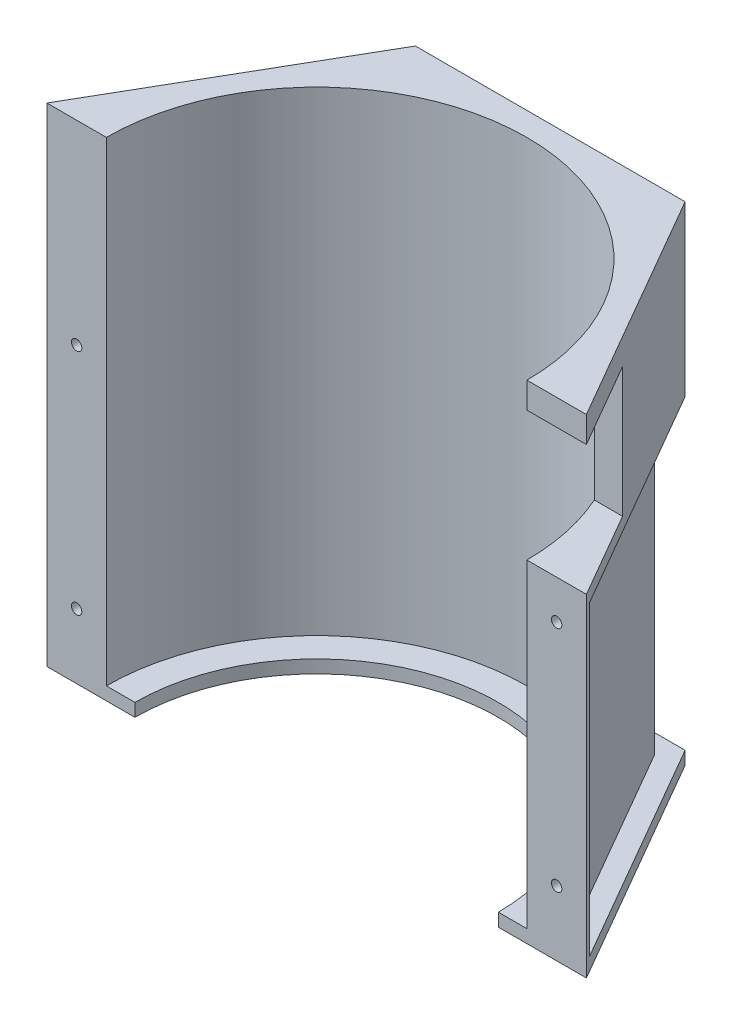
ISO-10303-21;
HEADER;
FILE_DESCRIPTION(('STEP AP214'),'2;1');
FILE_NAME('part.step','',(''),(''),'','','');
FILE_SCHEMA(('AUTOMOTIVE_DESIGN { 1 0 10303 214 1 1 1 1 }'));
ENDSEC;
DATA;
#1=APPLICATION_CONTEXT('core data for automotive mechanical design processes');
#2=APPLICATION_PROTOCOL_DEFINITION('international standard','automotive_design',2000,#1);
#3=PRODUCT_CONTEXT('',#1,'mechanical');
#4=PRODUCT('Part','Part','',(#3));
#5=PRODUCT_RELATED_PRODUCT_CATEGORY('part','',(#4));
#6=PRODUCT_DEFINITION_FORMATION('','',#4);
#7=PRODUCT_DEFINITION_CONTEXT('part definition',#1,'design');
#8=PRODUCT_DEFINITION('design','',#6,#7);
#9=PRODUCT_DEFINITION_SHAPE('','',#8);
#10=(LENGTH_UNIT() NAMED_UNIT(*) SI_UNIT(.MILLI.,.METRE.));
#11=(NAMED_UNIT(*) PLANE_ANGLE_UNIT() SI_UNIT($,.RADIAN.));
#12=(NAMED_UNIT(*) SI_UNIT($,.STERADIAN.) SOLID_ANGLE_UNIT());
#13=UNCERTAINTY_MEASURE_WITH_UNIT(LENGTH_MEASURE(1.E-05),#10,'distance_accuracy_value','');
#14=(GEOMETRIC_REPRESENTATION_CONTEXT(3) GLOBAL_UNCERTAINTY_ASSIGNED_CONTEXT((#13)) GLOBAL_UNIT_ASSIGNED_CONTEXT((#10,
#11,#12)) REPRESENTATION_CONTEXT('',''));
#15=CARTESIAN_POINT('',(0.,0.,0.));
#16=DIRECTION('',(0.,0.,1.));
#17=DIRECTION('',(1.,0.,0.));
#18=AXIS2_PLACEMENT_3D('',#15,#16,#17);
#19=CARTESIAN_POINT('',(0.,5.,0.));
#20=DIRECTION('',(0.,1.,0.));
#21=DIRECTION('',(0.,0.,1.));
#22=AXIS2_PLACEMENT_3D('',#19,#20,#21);
#23=PLANE('',#22);
#24=CARTESIAN_POINT('',(0.,5.,0.));
#25=DIRECTION('',(0.,-1.,0.));
#26=DIRECTION('',(0.,0.,1.));
#27=AXIS2_PLACEMENT_3D('',#24,#25,#26);
#28=CIRCLE('',#27,81.);
#29=CARTESIAN_POINT('',(-81.,5.,0.));
#30=VERTEX_POINT('',#29);
#31=CARTESIAN_POINT('',(81.,5.,0.));
#32=VERTEX_POINT('',#31);
#33=EDGE_CURVE('E257',#30,#32,#28,.T.);
#34=ORIENTED_EDGE('',*,*,#33,.F.);
#35=DIRECTION('',(1.,0.,0.));
#36=VECTOR('',#35,1.);
#37=CARTESIAN_POINT('',(-103.923048454133,5.,0.));
#38=LINE('',#37,#36);
#39=CARTESIAN_POINT('',(-70.,5.,0.));
#40=VERTEX_POINT('',#39);
#41=EDGE_CURVE('E513',#30,#40,#38,.T.);
#42=ORIENTED_EDGE('',*,*,#41,.T.);
#43=CARTESIAN_POINT('',(0.,5.,0.));
#44=DIRECTION('',(0.,-1.,0.));
#45=DIRECTION('',(0.,0.,1.));
#46=AXIS2_PLACEMENT_3D('',#43,#44,#45);
#47=CIRCLE('',#46,70.);
#48=CARTESIAN_POINT('',(70.,5.,0.));
#49=VERTEX_POINT('',#48);
#50=EDGE_CURVE('E450',#40,#49,#47,.T.);
#51=ORIENTED_EDGE('',*,*,#50,.T.);
#52=DIRECTION('',(1.,0.,0.));
#53=VECTOR('',#52,1.);
#54=CARTESIAN_POINT('',(70.,5.,0.));
#55=LINE('',#54,#53);
#56=EDGE_CURVE('E463',#49,#32,#55,.T.);
#57=ORIENTED_EDGE('',*,*,#56,.T.);
#58=EDGE_LOOP('',(#34,#42,#51,#57));
#59=FACE_BOUND('',#58,.T.);
#60=ADVANCED_FACE('F40',(#59),#23,.T.);
#61=CARTESIAN_POINT('',(70.,5.,0.));
#62=DIRECTION('',(0.,0.,-1.));
#63=DIRECTION('',(-1.,0.,0.));
#64=AXIS2_PLACEMENT_3D('',#61,#62,#63);
#65=PLANE('',#64);
#66=CARTESIAN_POINT('',(92.4615242270663,25.,0.));
#67=DIRECTION('',(0.,0.,1.));
#68=DIRECTION('',(1.,0.,0.));
#69=AXIS2_PLACEMENT_3D('',#66,#67,#68);
#70=CIRCLE('',#69,2.);
#71=CARTESIAN_POINT('',(94.4615242270663,25.,0.));
#72=VERTEX_POINT('',#71);
#73=EDGE_CURVE('E394',#72,#72,#70,.T.);
#74=ORIENTED_EDGE('',*,*,#73,.F.);
#75=EDGE_LOOP('',(#74));
#76=FACE_BOUND('',#75,.T.);
#77=CARTESIAN_POINT('',(92.4615242270663,113.,0.));
#78=DIRECTION('',(0.,0.,1.));
#79=DIRECTION('',(1.,0.,0.));
#80=AXIS2_PLACEMENT_3D('',#77,#78,#79);
#81=CIRCLE('',#80,2.);
#82=CARTESIAN_POINT('',(94.4615242270663,113.,0.));
#83=VERTEX_POINT('',#82);
#84=EDGE_CURVE('E389',#83,#83,#81,.T.);
#85=ORIENTED_EDGE('',*,*,#84,.F.);
#86=EDGE_LOOP('',(#85));
#87=FACE_BOUND('',#86,.T.);
#88=DIRECTION('',(1.,0.,0.));
#89=VECTOR('',#88,1.);
#90=CARTESIAN_POINT('',(70.,0.,0.));
#91=LINE('',#90,#89);
#92=CARTESIAN_POINT('',(70.,0.,0.));
#93=VERTEX_POINT('',#92);
#94=CARTESIAN_POINT('',(103.923048454133,0.,0.));
#95=VERTEX_POINT('',#94);
#96=EDGE_CURVE('E431',#93,#95,#91,.T.);
#97=ORIENTED_EDGE('',*,*,#96,.T.);
#98=DIRECTION('',(0.,-1.,0.));
#99=VECTOR('',#98,1.);
#100=CARTESIAN_POINT('',(103.923048454133,5.,0.));
#101=LINE('',#100,#99);
#102=CARTESIAN_POINT('',(103.923048454133,128.,0.));
#103=VERTEX_POINT('',#102);
#104=EDGE_CURVE('E210',#103,#95,#101,.T.);
#105=ORIENTED_EDGE('',*,*,#104,.F.);
#106=DIRECTION('',(1.,0.,0.));
#107=VECTOR('',#106,1.);
#108=CARTESIAN_POINT('',(81.,128.,0.));
#109=LINE('',#108,#107);
#110=CARTESIAN_POINT('',(81.,128.,0.));
#111=VERTEX_POINT('',#110);
#112=EDGE_CURVE('E309',#111,#103,#109,.T.);
#113=ORIENTED_EDGE('',*,*,#112,.F.);
#114=DIRECTION('',(0.,-1.,0.));
#115=VECTOR('',#114,1.);
#116=CARTESIAN_POINT('',(81.,123.,0.));
#117=LINE('',#116,#115);
#118=EDGE_CURVE('E251',#111,#32,#117,.T.);
#119=ORIENTED_EDGE('',*,*,#118,.T.);
#120=ORIENTED_EDGE('',*,*,#56,.F.);
#121=DIRECTION('',(0.,-1.,0.));
#122=VECTOR('',#121,1.);
#123=CARTESIAN_POINT('',(70.,5.,0.));
#124=LINE('',#123,#122);
#125=EDGE_CURVE('E464',#49,#93,#124,.T.);
#126=ORIENTED_EDGE('',*,*,#125,.T.);
#127=EDGE_LOOP('',(#97,#105,#113,#119,#120,#126));
#128=FACE_BOUND('',#127,.T.);
#129=ADVANCED_FACE('F42',(#76,#87,#128),#65,.F.);
#130=CARTESIAN_POINT('',(103.923048454133,5.,0.));
#131=DIRECTION('',(-0.866025403784438,0.,0.5));
#132=DIRECTION('',(0.5,0.,0.866025403784439));
#133=AXIS2_PLACEMENT_3D('',#130,#131,#132);
#134=PLANE('',#133);
#135=DIRECTION('',(-0.5,0.,-0.866025403784439));
#136=VECTOR('',#135,1.);
#137=CARTESIAN_POINT('',(103.923048454133,0.,0.));
#138=LINE('',#137,#136);
#139=CARTESIAN_POINT('',(51.9615242270663,0.,-90.0000000000001));
#140=VERTEX_POINT('',#139);
#141=EDGE_CURVE('E435',#95,#140,#138,.T.);
#142=ORIENTED_EDGE('',*,*,#141,.T.);
#143=DIRECTION('',(0.,-1.,0.));
#144=VECTOR('',#143,1.);
#145=CARTESIAN_POINT('',(51.9615242270663,5.,-90.0000000000001));
#146=LINE('',#145,#144);
#147=CARTESIAN_POINT('',(51.9615242270663,5.,-90.0000000000001));
#148=VERTEX_POINT('',#147);
#149=EDGE_CURVE('E479',#148,#140,#146,.T.);
#150=ORIENTED_EDGE('',*,*,#149,.F.);
#151=DIRECTION('',(-0.5,0.,-0.866025403784439));
#152=VECTOR('',#151,1.);
#153=CARTESIAN_POINT('',(103.923048454133,5.,0.));
#154=LINE('',#153,#152);
#155=CARTESIAN_POINT('',(102.190997646564,5.,-3.00000000000001));
#156=VERTEX_POINT('',#155);
#157=EDGE_CURVE('E505',#156,#148,#154,.T.);
#158=ORIENTED_EDGE('',*,*,#157,.F.);
#159=DIRECTION('',(0.,-1.,0.));
#160=VECTOR('',#159,1.);
#161=CARTESIAN_POINT('',(102.190997646564,123.,-3.00000000000001));
#162=LINE('',#161,#160);
#163=CARTESIAN_POINT('',(102.190997646564,123.,-3.00000000000001));
#164=VERTEX_POINT('',#163);
#165=EDGE_CURVE('E440',#164,#156,#162,.T.);
#166=ORIENTED_EDGE('',*,*,#165,.F.);
#167=DIRECTION('',(-0.5,0.,-0.866025403784438));
#168=VECTOR('',#167,1.);
#169=CARTESIAN_POINT('',(103.923048454133,123.,0.));
#170=LINE('',#169,#168);
#171=CARTESIAN_POINT('',(51.9615242270663,123.,-90.0000000000001));
#172=VERTEX_POINT('',#171);
#173=EDGE_CURVE('E313',#164,#172,#170,.T.);
#174=ORIENTED_EDGE('',*,*,#173,.T.);
#175=DIRECTION('',(0.,-1.,0.));
#176=VECTOR('',#175,1.);
#177=CARTESIAN_POINT('',(51.9615242270663,128.,-90.0000000000001));
#178=LINE('',#177,#176);
#179=CARTESIAN_POINT('',(51.9615242270663,188.,-90.0000000000001));
#180=VERTEX_POINT('',#179);
#181=EDGE_CURVE('E281',#180,#172,#178,.T.);
#182=ORIENTED_EDGE('',*,*,#181,.F.);
#183=DIRECTION('',(-0.5,0.,-0.866025403784438));
#184=VECTOR('',#183,1.);
#185=CARTESIAN_POINT('',(51.9615242270663,188.,-90.0000000000001));
#186=LINE('',#185,#184);
#187=CARTESIAN_POINT('',(103.923048454133,188.,0.));
#188=VERTEX_POINT('',#187);
#189=EDGE_CURVE('E367',#188,#180,#186,.T.);
#190=ORIENTED_EDGE('',*,*,#189,.F.);
#191=DIRECTION('',(0.,-1.,0.));
#192=VECTOR('',#191,1.);
#193=CARTESIAN_POINT('',(103.923048454133,188.,0.));
#194=LINE('',#193,#192);
#195=CARTESIAN_POINT('',(103.923048454133,178.,0.));
#196=VERTEX_POINT('',#195);
#197=EDGE_CURVE('E344',#188,#196,#194,.T.);
#198=ORIENTED_EDGE('',*,*,#197,.T.);
#199=DIRECTION('',(-0.5,0.,-0.866025403784438));
#200=VECTOR('',#199,1.);
#201=CARTESIAN_POINT('',(51.9615242270663,178.,-90.0000000000001));
#202=LINE('',#201,#200);
#203=CARTESIAN_POINT('',(84.870489570875,178.,-33.));
#204=VERTEX_POINT('',#203);
#205=EDGE_CURVE('E349',#196,#204,#202,.T.);
#206=ORIENTED_EDGE('',*,*,#205,.T.);
#207=DIRECTION('',(0.,-1.,0.));
#208=VECTOR('',#207,1.);
#209=CARTESIAN_POINT('',(84.870489570875,178.,-33.));
#210=LINE('',#209,#208);
#211=CARTESIAN_POINT('',(84.870489570875,128.,-33.));
#212=VERTEX_POINT('',#211);
#213=EDGE_CURVE('E328',#204,#212,#210,.T.);
#214=ORIENTED_EDGE('',*,*,#213,.T.);
#215=DIRECTION('',(-0.5,0.,-0.866025403784438));
#216=VECTOR('',#215,1.);
#217=CARTESIAN_POINT('',(103.923048454133,128.,0.));
#218=LINE('',#217,#216);
#219=EDGE_CURVE('E319',#103,#212,#218,.T.);
#220=ORIENTED_EDGE('',*,*,#219,.F.);
#221=ORIENTED_EDGE('',*,*,#104,.T.);
#222=EDGE_LOOP('',(#142,#150,#158,#166,#174,#182,#190,#198,#206,#214,#220,#221));
#223=FACE_BOUND('',#222,.T.);
#224=ADVANCED_FACE('F544',(#223),#134,.F.);
#225=CARTESIAN_POINT('',(51.9615242270663,5.,-90.0000000000001));
#226=DIRECTION('',(0.,0.,1.));
#227=DIRECTION('',(1.,0.,0.));
#228=AXIS2_PLACEMENT_3D('',#225,#226,#227);
#229=PLANE('',#228);
#230=DIRECTION('',(-1.,0.,0.));
#231=VECTOR('',#230,1.);
#232=CARTESIAN_POINT('',(51.9615242270663,0.,-90.0000000000001));
#233=LINE('',#232,#231);
#234=CARTESIAN_POINT('',(-51.9615242270663,0.,-90.0000000000001));
#235=VERTEX_POINT('',#234);
#236=EDGE_CURVE('E444',#140,#235,#233,.T.);
#237=ORIENTED_EDGE('',*,*,#236,.T.);
#238=DIRECTION('',(0.,-1.,0.));
#239=VECTOR('',#238,1.);
#240=CARTESIAN_POINT('',(-51.9615242270663,5.,-90.0000000000001));
#241=LINE('',#240,#239);
#242=CARTESIAN_POINT('',(-51.9615242270663,5.,-90.0000000000001));
#243=VERTEX_POINT('',#242);
#244=EDGE_CURVE('E475',#243,#235,#241,.T.);
#245=ORIENTED_EDGE('',*,*,#244,.F.);
#246=DIRECTION('',(-1.,0.,0.));
#247=VECTOR('',#246,1.);
#248=CARTESIAN_POINT('',(51.9615242270663,5.,-90.0000000000001));
#249=LINE('',#248,#247);
#250=EDGE_CURVE('E508',#148,#243,#249,.T.);
#251=ORIENTED_EDGE('',*,*,#250,.F.);
#252=ORIENTED_EDGE('',*,*,#149,.T.);
#253=EDGE_LOOP('',(#237,#245,#251,#252));
#254=FACE_BOUND('',#253,.T.);
#255=ADVANCED_FACE('F540',(#254),#229,.F.);
#256=CARTESIAN_POINT('',(-51.9615242270663,5.,-90.0000000000001));
#257=DIRECTION('',(0.866025403784439,0.,0.5));
#258=DIRECTION('',(0.5,0.,-0.866025403784439));
#259=AXIS2_PLACEMENT_3D('',#256,#257,#258);
#260=PLANE('',#259);
#261=DIRECTION('',(-0.5,0.,0.866025403784439));
#262=VECTOR('',#261,1.);
#263=CARTESIAN_POINT('',(-51.9615242270663,0.,-90.0000000000001));
#264=LINE('',#263,#262);
#265=CARTESIAN_POINT('',(-103.923048454133,0.,0.));
#266=VERTEX_POINT('',#265);
#267=EDGE_CURVE('E455',#235,#266,#264,.T.);
#268=ORIENTED_EDGE('',*,*,#267,.T.);
#269=DIRECTION('',(0.,-1.,0.));
#270=VECTOR('',#269,1.);
#271=CARTESIAN_POINT('',(-103.923048454133,5.,0.));
#272=LINE('',#271,#270);
#273=CARTESIAN_POINT('',(-103.923048454133,188.,0.));
#274=VERTEX_POINT('',#273);
#275=EDGE_CURVE('E471',#274,#266,#272,.T.);
#276=ORIENTED_EDGE('',*,*,#275,.F.);
#277=DIRECTION('',(-0.5,0.,0.866025403784439));
#278=VECTOR('',#277,1.);
#279=CARTESIAN_POINT('',(-103.923048454133,188.,0.));
#280=LINE('',#279,#278);
#281=CARTESIAN_POINT('',(-51.9615242270663,188.,-90.0000000000001));
#282=VERTEX_POINT('',#281);
#283=EDGE_CURVE('E348',#282,#274,#280,.T.);
#284=ORIENTED_EDGE('',*,*,#283,.F.);
#285=DIRECTION('',(0.,-1.,0.));
#286=VECTOR('',#285,1.);
#287=CARTESIAN_POINT('',(-51.9615242270663,128.,-90.0000000000001));
#288=LINE('',#287,#286);
#289=CARTESIAN_POINT('',(-51.9615242270663,123.,-90.0000000000001));
#290=VERTEX_POINT('',#289);
#291=EDGE_CURVE('E301',#282,#290,#288,.T.);
#292=ORIENTED_EDGE('',*,*,#291,.T.);
#293=DIRECTION('',(-0.5,0.,0.866025403784439));
#294=VECTOR('',#293,1.);
#295=CARTESIAN_POINT('',(-51.9615242270663,123.,-90.0000000000001));
#296=LINE('',#295,#294);
#297=CARTESIAN_POINT('',(-102.190997646564,123.,-3.00000000000002));
#298=VERTEX_POINT('',#297);
#299=EDGE_CURVE('E306',#290,#298,#296,.T.);
#300=ORIENTED_EDGE('',*,*,#299,.T.);
#301=DIRECTION('',(0.,-1.,0.));
#302=VECTOR('',#301,1.);
#303=CARTESIAN_POINT('',(-102.190997646564,123.,-3.00000000000002));
#304=LINE('',#303,#302);
#305=CARTESIAN_POINT('',(-102.190997646564,5.,-3.00000000000003));
#306=VERTEX_POINT('',#305);
#307=EDGE_CURVE('E239',#298,#306,#304,.T.);
#308=ORIENTED_EDGE('',*,*,#307,.T.);
#309=DIRECTION('',(-0.5,0.,0.866025403784439));
#310=VECTOR('',#309,1.);
#311=CARTESIAN_POINT('',(-51.9615242270663,5.,-90.0000000000001));
#312=LINE('',#311,#310);
#313=EDGE_CURVE('E511',#243,#306,#312,.T.);
#314=ORIENTED_EDGE('',*,*,#313,.F.);
#315=ORIENTED_EDGE('',*,*,#244,.T.);
#316=EDGE_LOOP('',(#268,#276,#284,#292,#300,#308,#314,#315));
#317=FACE_BOUND('',#316,.T.);
#318=ADVANCED_FACE('F535',(#317),#260,.F.);
#319=CARTESIAN_POINT('',(-103.923048454133,5.,0.));
#320=DIRECTION('',(0.,0.,-1.));
#321=DIRECTION('',(-1.,0.,0.));
#322=AXIS2_PLACEMENT_3D('',#319,#320,#321);
#323=PLANE('',#322);
#324=CARTESIAN_POINT('',(-92.4615242270663,25.,0.));
#325=DIRECTION('',(0.,0.,1.));
#326=DIRECTION('',(1.,0.,0.));
#327=AXIS2_PLACEMENT_3D('',#324,#325,#326);
#328=CIRCLE('',#327,2.);
#329=CARTESIAN_POINT('',(-90.4615242270663,25.,0.));
#330=VERTEX_POINT('',#329);
#331=EDGE_CURVE('E390',#330,#330,#328,.T.);
#332=ORIENTED_EDGE('',*,*,#331,.F.);
#333=EDGE_LOOP('',(#332));
#334=FACE_BOUND('',#333,.T.);
#335=CARTESIAN_POINT('',(-92.4615242270663,113.,0.));
#336=DIRECTION('',(0.,0.,1.));
#337=DIRECTION('',(1.,0.,0.));
#338=AXIS2_PLACEMENT_3D('',#335,#336,#337);
#339=CIRCLE('',#338,2.);
#340=CARTESIAN_POINT('',(-90.4615242270663,113.,0.));
#341=VERTEX_POINT('',#340);
#342=EDGE_CURVE('E222',#341,#341,#339,.T.);
#343=ORIENTED_EDGE('',*,*,#342,.F.);
#344=EDGE_LOOP('',(#343));
#345=FACE_BOUND('',#344,.T.);
#346=DIRECTION('',(1.,0.,0.));
#347=VECTOR('',#346,1.);
#348=CARTESIAN_POINT('',(-103.923048454133,0.,0.));
#349=LINE('',#348,#347);
#350=CARTESIAN_POINT('',(-70.,0.,0.));
#351=VERTEX_POINT('',#350);
#352=EDGE_CURVE('E458',#266,#351,#349,.T.);
#353=ORIENTED_EDGE('',*,*,#352,.T.);
#354=DIRECTION('',(0.,-1.,0.));
#355=VECTOR('',#354,1.);
#356=CARTESIAN_POINT('',(-70.,5.,0.));
#357=LINE('',#356,#355);
#358=EDGE_CURVE('E467',#40,#351,#357,.T.);
#359=ORIENTED_EDGE('',*,*,#358,.F.);
#360=ORIENTED_EDGE('',*,*,#41,.F.);
#361=DIRECTION('',(0.,-1.,0.));
#362=VECTOR('',#361,1.);
#363=CARTESIAN_POINT('',(-81.,123.,0.));
#364=LINE('',#363,#362);
#365=CARTESIAN_POINT('',(-81.,188.,0.));
#366=VERTEX_POINT('',#365);
#367=EDGE_CURVE('E245',#366,#30,#364,.T.);
#368=ORIENTED_EDGE('',*,*,#367,.F.);
#369=DIRECTION('',(1.,0.,0.));
#370=VECTOR('',#369,1.);
#371=CARTESIAN_POINT('',(-103.923048454133,188.,0.));
#372=LINE('',#371,#370);
#373=EDGE_CURVE('E353',#274,#366,#372,.T.);
#374=ORIENTED_EDGE('',*,*,#373,.F.);
#375=ORIENTED_EDGE('',*,*,#275,.T.);
#376=EDGE_LOOP('',(#353,#359,#360,#368,#374,#375));
#377=FACE_BOUND('',#376,.T.);
#378=ADVANCED_FACE('F532',(#334,#345,#377),#323,.F.);
#379=CARTESIAN_POINT('',(0.,5.,0.));
#380=DIRECTION('',(0.,-1.,0.));
#381=DIRECTION('',(0.,0.,-1.));
#382=AXIS2_PLACEMENT_3D('',#379,#380,#381);
#383=CYLINDRICAL_SURFACE('',#382,70.);
#384=CARTESIAN_POINT('',(0.,0.,0.));
#385=DIRECTION('',(0.,-1.,0.));
#386=DIRECTION('',(0.,0.,1.));
#387=AXIS2_PLACEMENT_3D('',#384,#385,#386);
#388=CIRCLE('',#387,70.);
#389=EDGE_CURVE('E433',#351,#93,#388,.T.);
#390=ORIENTED_EDGE('',*,*,#389,.T.);
#391=ORIENTED_EDGE('',*,*,#125,.F.);
#392=ORIENTED_EDGE('',*,*,#50,.F.);
#393=ORIENTED_EDGE('',*,*,#358,.T.);
#394=EDGE_LOOP('',(#390,#391,#392,#393));
#395=FACE_BOUND('',#394,.T.);
#396=ADVANCED_FACE('F523',(#395),#383,.F.);
#397=CARTESIAN_POINT('',(30.,5.,-85.0000000000001));
#398=DIRECTION('',(0.,1.,0.));
#399=DIRECTION('',(0.,0.,1.));
#400=AXIS2_PLACEMENT_3D('',#397,#398,#399);
#401=CIRCLE('',#400,2.);
#402=CARTESIAN_POINT('',(30.,5.,-83.0000000000001));
#403=VERTEX_POINT('',#402);
#404=EDGE_CURVE('E395',#403,#403,#401,.T.);
#405=ORIENTED_EDGE('',*,*,#404,.F.);
#406=EDGE_LOOP('',(#405));
#407=FACE_BOUND('',#406,.T.);
#408=CARTESIAN_POINT('',(-30.,5.,-85.0000000000001));
#409=DIRECTION('',(0.,1.,0.));
#410=DIRECTION('',(0.,0.,1.));
#411=AXIS2_PLACEMENT_3D('',#408,#409,#410);
#412=CIRCLE('',#411,2.);
#413=CARTESIAN_POINT('',(-30.,5.,-83.0000000000001));
#414=VERTEX_POINT('',#413);
#415=EDGE_CURVE('E405',#414,#414,#412,.T.);
#416=ORIENTED_EDGE('',*,*,#415,.F.);
#417=EDGE_LOOP('',(#416));
#418=FACE_BOUND('',#417,.T.);
#419=DIRECTION('',(-1.,0.,0.));
#420=VECTOR('',#419,1.);
#421=CARTESIAN_POINT('',(-102.190997646564,5.,-3.00000000000002));
#422=LINE('',#421,#420);
#423=CARTESIAN_POINT('',(-93.5307436087194,5.,-3.00000000000001));
#424=VERTEX_POINT('',#423);
#425=EDGE_CURVE('E262',#424,#306,#422,.T.);
#426=ORIENTED_EDGE('',*,*,#425,.F.);
#427=DIRECTION('',(-0.500000000000003,0.,0.866025403784437));
#428=VECTOR('',#427,1.);
#429=CARTESIAN_POINT('',(-47.6313972081437,5.,-82.5));
#430=LINE('',#429,#428);
#431=CARTESIAN_POINT('',(-47.6313972081437,5.,-82.5));
#432=VERTEX_POINT('',#431);
#433=EDGE_CURVE('E265',#432,#424,#430,.T.);
#434=ORIENTED_EDGE('',*,*,#433,.F.);
#435=DIRECTION('',(-1.,0.,0.));
#436=VECTOR('',#435,1.);
#437=CARTESIAN_POINT('',(47.6313972081443,5.,-82.4999999999997));
#438=LINE('',#437,#436);
#439=CARTESIAN_POINT('',(47.6313972081443,5.,-82.4999999999997));
#440=VERTEX_POINT('',#439);
#441=EDGE_CURVE('E269',#440,#432,#438,.T.);
#442=ORIENTED_EDGE('',*,*,#441,.F.);
#443=DIRECTION('',(-0.499999999999997,0.,-0.866025403784441));
#444=VECTOR('',#443,1.);
#445=CARTESIAN_POINT('',(93.5307436087194,5.,-2.99999999999917));
#446=LINE('',#445,#444);
#447=CARTESIAN_POINT('',(93.5307436087194,5.,-2.99999999999917));
#448=VERTEX_POINT('',#447);
#449=EDGE_CURVE('E273',#448,#440,#446,.T.);
#450=ORIENTED_EDGE('',*,*,#449,.F.);
#451=DIRECTION('',(-1.,0.,0.));
#452=VECTOR('',#451,1.);
#453=CARTESIAN_POINT('',(102.190997646564,5.,-3.00000000000001));
#454=LINE('',#453,#452);
#455=EDGE_CURVE('E277',#156,#448,#454,.T.);
#456=ORIENTED_EDGE('',*,*,#455,.F.);
#457=ORIENTED_EDGE('',*,*,#157,.T.);
#458=ORIENTED_EDGE('',*,*,#250,.T.);
#459=ORIENTED_EDGE('',*,*,#313,.T.);
#460=EDGE_LOOP('',(#426,#434,#442,#450,#456,#457,#458,#459));
#461=FACE_BOUND('',#460,.T.);
#462=ADVANCED_FACE('F424',(#407,#418,#461),#23,.T.);
#463=CARTESIAN_POINT('',(0.,0.,0.));
#464=DIRECTION('',(0.,1.,0.));
#465=DIRECTION('',(0.,0.,1.));
#466=AXIS2_PLACEMENT_3D('',#463,#464,#465);
#467=PLANE('',#466);
#468=CARTESIAN_POINT('',(30.,0.,-85.0000000000001));
#469=DIRECTION('',(0.,-1.,0.));
#470=DIRECTION('',(0.,0.,-1.));
#471=AXIS2_PLACEMENT_3D('',#468,#469,#470);
#472=CIRCLE('',#471,2.);
#473=CARTESIAN_POINT('',(30.,0.,-87.0000000000001));
#474=VERTEX_POINT('',#473);
#475=EDGE_CURVE('E409',#474,#474,#472,.T.);
#476=ORIENTED_EDGE('',*,*,#475,.F.);
#477=EDGE_LOOP('',(#476));
#478=FACE_BOUND('',#477,.T.);
#479=CARTESIAN_POINT('',(-30.,0.,-85.0000000000001));
#480=DIRECTION('',(0.,-1.,0.));
#481=DIRECTION('',(0.,0.,-1.));
#482=AXIS2_PLACEMENT_3D('',#479,#480,#481);
#483=CIRCLE('',#482,2.);
#484=CARTESIAN_POINT('',(-30.,0.,-87.0000000000001));
#485=VERTEX_POINT('',#484);
#486=EDGE_CURVE('E410',#485,#485,#483,.T.);
#487=ORIENTED_EDGE('',*,*,#486,.F.);
#488=EDGE_LOOP('',(#487));
#489=FACE_BOUND('',#488,.T.);
#490=ORIENTED_EDGE('',*,*,#96,.F.);
#491=ORIENTED_EDGE('',*,*,#389,.F.);
#492=ORIENTED_EDGE('',*,*,#352,.F.);
#493=ORIENTED_EDGE('',*,*,#267,.F.);
#494=ORIENTED_EDGE('',*,*,#236,.F.);
#495=ORIENTED_EDGE('',*,*,#141,.F.);
#496=EDGE_LOOP('',(#490,#491,#492,#493,#494,#495));
#497=FACE_BOUND('',#496,.T.);
#498=ADVANCED_FACE('F420',(#478,#489,#497),#467,.F.);
#499=CARTESIAN_POINT('',(102.190997646564,123.,-3.00000000000001));
#500=DIRECTION('',(0.,0.,1.));
#501=DIRECTION('',(1.,0.,0.));
#502=AXIS2_PLACEMENT_3D('',#499,#500,#501);
#503=PLANE('',#502);
#504=DIRECTION('',(0.,-1.,0.));
#505=VECTOR('',#504,1.);
#506=CARTESIAN_POINT('',(93.5307436087194,123.,-2.99999999999917));
#507=LINE('',#506,#505);
#508=CARTESIAN_POINT('',(93.5307436087194,23.309801812243,-2.99999999999917));
#509=VERTEX_POINT('',#508);
#510=EDGE_CURVE('E497',#509,#448,#507,.T.);
#511=ORIENTED_EDGE('',*,*,#510,.F.);
#512=CARTESIAN_POINT('',(92.4615242270663,25.,-2.99999999999907));
#513=DIRECTION('',(0.,0.,1.));
#514=DIRECTION('',(1.,0.,0.));
#515=AXIS2_PLACEMENT_3D('',#512,#513,#514);
#516=CIRCLE('',#515,2.);
#517=CARTESIAN_POINT('',(93.5307436087194,26.6901981877571,-2.99999999999917));
#518=VERTEX_POINT('',#517);
#519=EDGE_CURVE('E55',#509,#518,#516,.T.);
#520=ORIENTED_EDGE('',*,*,#519,.T.);
#521=CARTESIAN_POINT('',(93.5307436087194,111.309801812243,-2.99999999999917));
#522=VERTEX_POINT('',#521);
#523=EDGE_CURVE('E492',#522,#518,#507,.T.);
#524=ORIENTED_EDGE('',*,*,#523,.F.);
#525=CARTESIAN_POINT('',(92.4615242270663,113.,-2.99999999999907));
#526=DIRECTION('',(0.,0.,1.));
#527=DIRECTION('',(1.,0.,0.));
#528=AXIS2_PLACEMENT_3D('',#525,#526,#527);
#529=CIRCLE('',#528,2.);
#530=CARTESIAN_POINT('',(93.5307436087194,114.690198187757,-2.99999999999917));
#531=VERTEX_POINT('',#530);
#532=EDGE_CURVE('E61',#522,#531,#529,.T.);
#533=ORIENTED_EDGE('',*,*,#532,.T.);
#534=CARTESIAN_POINT('',(93.5307436087194,123.,-2.99999999999917));
#535=VERTEX_POINT('',#534);
#536=EDGE_CURVE('E447',#535,#531,#507,.T.);
#537=ORIENTED_EDGE('',*,*,#536,.F.);
#538=DIRECTION('',(-1.,0.,0.));
#539=VECTOR('',#538,1.);
#540=CARTESIAN_POINT('',(102.190997646564,123.,-3.00000000000001));
#541=LINE('',#540,#539);
#542=EDGE_CURVE('E261',#164,#535,#541,.T.);
#543=ORIENTED_EDGE('',*,*,#542,.F.);
#544=ORIENTED_EDGE('',*,*,#165,.T.);
#545=ORIENTED_EDGE('',*,*,#455,.T.);
#546=EDGE_LOOP('',(#511,#520,#524,#533,#537,#543,#544,#545));
#547=FACE_BOUND('',#546,.T.);
#548=ADVANCED_FACE('F423',(#547),#503,.F.);
#549=CARTESIAN_POINT('',(93.5307436087194,123.,-2.99999999999917));
#550=DIRECTION('',(-0.866025403784441,0.,0.499999999999997));
#551=DIRECTION('',(0.499999999999997,0.,0.866025403784441));
#552=AXIS2_PLACEMENT_3D('',#549,#550,#551);
#553=PLANE('',#552);
#554=ORIENTED_EDGE('',*,*,#523,.T.);
#555=CARTESIAN_POINT('',(92.4615242270663,25.,-4.8519422934598));
#556=DIRECTION('',(-0.866025403784441,0.,0.499999999999997));
#557=DIRECTION('',(0.499999999999997,0.,0.866025403784441));
#558=AXIS2_PLACEMENT_3D('',#555,#556,#557);
#559=ELLIPSE('',#558,4.00000000000002,2.);
#560=EDGE_CURVE('E11',#518,#509,#559,.T.);
#561=ORIENTED_EDGE('',*,*,#560,.T.);
#562=ORIENTED_EDGE('',*,*,#510,.T.);
#563=ORIENTED_EDGE('',*,*,#449,.T.);
#564=DIRECTION('',(0.,-1.,0.));
#565=VECTOR('',#564,1.);
#566=CARTESIAN_POINT('',(47.6313972081443,123.,-82.4999999999997));
#567=LINE('',#566,#565);
#568=CARTESIAN_POINT('',(47.6313972081443,123.,-82.4999999999997));
#569=VERTEX_POINT('',#568);
#570=EDGE_CURVE('E235',#569,#440,#567,.T.);
#571=ORIENTED_EDGE('',*,*,#570,.F.);
#572=DIRECTION('',(-0.499999999999997,0.,-0.866025403784441));
#573=VECTOR('',#572,1.);
#574=CARTESIAN_POINT('',(93.5307436087194,123.,-2.99999999999917));
#575=LINE('',#574,#573);
#576=EDGE_CURVE('E291',#535,#569,#575,.T.);
#577=ORIENTED_EDGE('',*,*,#576,.F.);
#578=ORIENTED_EDGE('',*,*,#536,.T.);
#579=CARTESIAN_POINT('',(92.4615242270663,113.,-4.8519422934598));
#580=DIRECTION('',(-0.866025403784441,0.,0.499999999999997));
#581=DIRECTION('',(0.499999999999997,0.,0.866025403784441));
#582=AXIS2_PLACEMENT_3D('',#579,#580,#581);
#583=ELLIPSE('',#582,4.00000000000002,2.);
#584=EDGE_CURVE('E49',#531,#522,#583,.T.);
#585=ORIENTED_EDGE('',*,*,#584,.T.);
#586=EDGE_LOOP('',(#554,#561,#562,#563,#571,#577,#578,#585));
#587=FACE_BOUND('',#586,.T.);
#588=ADVANCED_FACE('F491',(#587),#553,.F.);
#589=CARTESIAN_POINT('',(47.6313972081443,123.,-82.4999999999997));
#590=DIRECTION('',(0.,0.,1.));
#591=DIRECTION('',(1.,0.,0.));
#592=AXIS2_PLACEMENT_3D('',#589,#590,#591);
#593=PLANE('',#592);
#594=ORIENTED_EDGE('',*,*,#441,.T.);
#595=DIRECTION('',(0.,-1.,0.));
#596=VECTOR('',#595,1.);
#597=CARTESIAN_POINT('',(-47.6313972081437,123.,-82.5));
#598=LINE('',#597,#596);
#599=CARTESIAN_POINT('',(-47.6313972081437,123.,-82.5));
#600=VERTEX_POINT('',#599);
#601=EDGE_CURVE('E229',#600,#432,#598,.T.);
#602=ORIENTED_EDGE('',*,*,#601,.F.);
#603=DIRECTION('',(-1.,0.,0.));
#604=VECTOR('',#603,1.);
#605=CARTESIAN_POINT('',(47.6313972081443,123.,-82.4999999999997));
#606=LINE('',#605,#604);
#607=EDGE_CURVE('E287',#569,#600,#606,.T.);
#608=ORIENTED_EDGE('',*,*,#607,.F.);
#609=ORIENTED_EDGE('',*,*,#570,.T.);
#610=EDGE_LOOP('',(#594,#602,#608,#609));
#611=FACE_BOUND('',#610,.T.);
#612=ADVANCED_FACE('F573',(#611),#593,.F.);
#613=CARTESIAN_POINT('',(-47.6313972081437,123.,-82.5));
#614=DIRECTION('',(0.866025403784437,0.,0.500000000000003));
#615=DIRECTION('',(0.500000000000003,0.,-0.866025403784437));
#616=AXIS2_PLACEMENT_3D('',#613,#614,#615);
#617=PLANE('',#616);
#618=DIRECTION('',(0.,-1.,0.));
#619=VECTOR('',#618,1.);
#620=CARTESIAN_POINT('',(-93.5307436087194,123.,-3.00000000000001));
#621=LINE('',#620,#619);
#622=CARTESIAN_POINT('',(-93.5307436087194,23.3098018122429,-3.00000000000001));
#623=VERTEX_POINT('',#622);
#624=EDGE_CURVE('E231',#623,#424,#621,.T.);
#625=ORIENTED_EDGE('',*,*,#624,.F.);
#626=CARTESIAN_POINT('',(-92.4615242270663,25.,-4.85194229346051));
#627=DIRECTION('',(0.866025403784437,0.,0.500000000000003));
#628=DIRECTION('',(-0.500000000000003,0.,0.866025403784437));
#629=AXIS2_PLACEMENT_3D('',#626,#627,#628);
#630=ELLIPSE('',#629,3.99999999999997,2.);
#631=CARTESIAN_POINT('',(-93.5307436087194,26.6901981877571,-3.00000000000001));
#632=VERTEX_POINT('',#631);
#633=EDGE_CURVE('E221',#623,#632,#630,.T.);
#634=ORIENTED_EDGE('',*,*,#633,.T.);
#635=CARTESIAN_POINT('',(-93.5307436087194,111.309801812243,-3.00000000000001));
#636=VERTEX_POINT('',#635);
#637=EDGE_CURVE('E219',#636,#632,#621,.T.);
#638=ORIENTED_EDGE('',*,*,#637,.F.);
#639=CARTESIAN_POINT('',(-92.4615242270663,113.,-4.85194229346051));
#640=DIRECTION('',(0.866025403784437,0.,0.500000000000003));
#641=DIRECTION('',(-0.500000000000003,0.,0.866025403784437));
#642=AXIS2_PLACEMENT_3D('',#639,#640,#641);
#643=ELLIPSE('',#642,3.99999999999997,2.);
#644=CARTESIAN_POINT('',(-93.5307436087194,114.690198187757,-3.00000000000001));
#645=VERTEX_POINT('',#644);
#646=EDGE_CURVE('E203',#636,#645,#643,.T.);
#647=ORIENTED_EDGE('',*,*,#646,.T.);
#648=CARTESIAN_POINT('',(-93.5307436087194,123.,-3.00000000000001));
#649=VERTEX_POINT('',#648);
#650=EDGE_CURVE('E216',#649,#645,#621,.T.);
#651=ORIENTED_EDGE('',*,*,#650,.F.);
#652=DIRECTION('',(-0.500000000000003,0.,0.866025403784437));
#653=VECTOR('',#652,1.);
#654=CARTESIAN_POINT('',(-47.6313972081437,123.,-82.5));
#655=LINE('',#654,#653);
#656=EDGE_CURVE('E284',#600,#649,#655,.T.);
#657=ORIENTED_EDGE('',*,*,#656,.F.);
#658=ORIENTED_EDGE('',*,*,#601,.T.);
#659=ORIENTED_EDGE('',*,*,#433,.T.);
#660=EDGE_LOOP('',(#625,#634,#638,#647,#651,#657,#658,#659));
#661=FACE_BOUND('',#660,.T.);
#662=ADVANCED_FACE('F214',(#661),#617,.F.);
#663=CARTESIAN_POINT('',(-102.190997646564,123.,-3.00000000000002));
#664=DIRECTION('',(0.,0.,1.));
#665=DIRECTION('',(1.,0.,0.));
#666=AXIS2_PLACEMENT_3D('',#663,#664,#665);
#667=PLANE('',#666);
#668=ORIENTED_EDGE('',*,*,#637,.T.);
#669=CARTESIAN_POINT('',(-92.4615242270663,25.,-3.00000000000001));
#670=DIRECTION('',(0.,0.,1.));
#671=DIRECTION('',(1.,0.,0.));
#672=AXIS2_PLACEMENT_3D('',#669,#670,#671);
#673=CIRCLE('',#672,2.);
#674=EDGE_CURVE('E209',#632,#623,#673,.T.);
#675=ORIENTED_EDGE('',*,*,#674,.T.);
#676=ORIENTED_EDGE('',*,*,#624,.T.);
#677=ORIENTED_EDGE('',*,*,#425,.T.);
#678=ORIENTED_EDGE('',*,*,#307,.F.);
#679=DIRECTION('',(-1.,0.,0.));
#680=VECTOR('',#679,1.);
#681=CARTESIAN_POINT('',(-102.190997646564,123.,-3.00000000000002));
#682=LINE('',#681,#680);
#683=EDGE_CURVE('E226',#649,#298,#682,.T.);
#684=ORIENTED_EDGE('',*,*,#683,.F.);
#685=ORIENTED_EDGE('',*,*,#650,.T.);
#686=CARTESIAN_POINT('',(-92.4615242270663,113.,-3.00000000000001));
#687=DIRECTION('',(0.,0.,1.));
#688=DIRECTION('',(1.,0.,0.));
#689=AXIS2_PLACEMENT_3D('',#686,#687,#688);
#690=CIRCLE('',#689,2.);
#691=EDGE_CURVE('E200',#645,#636,#690,.T.);
#692=ORIENTED_EDGE('',*,*,#691,.T.);
#693=EDGE_LOOP('',(#668,#675,#676,#677,#678,#684,#685,#692));
#694=FACE_BOUND('',#693,.T.);
#695=ADVANCED_FACE('F224',(#694),#667,.F.);
#696=CARTESIAN_POINT('',(0.,123.,0.));
#697=DIRECTION('',(0.,-1.,0.));
#698=DIRECTION('',(0.,0.,-1.));
#699=AXIS2_PLACEMENT_3D('',#696,#697,#698);
#700=CYLINDRICAL_SURFACE('',#699,81.);
#701=ORIENTED_EDGE('',*,*,#33,.T.);
#702=ORIENTED_EDGE('',*,*,#118,.F.);
#703=CARTESIAN_POINT('',(0.,128.,0.));
#704=DIRECTION('',(0.,-1.,0.));
#705=DIRECTION('',(0.,0.,1.));
#706=AXIS2_PLACEMENT_3D('',#703,#704,#705);
#707=CIRCLE('',#706,81.);
#708=CARTESIAN_POINT('',(73.9729680356277,128.,-33.));
#709=VERTEX_POINT('',#708);
#710=EDGE_CURVE('E305',#709,#111,#707,.T.);
#711=ORIENTED_EDGE('',*,*,#710,.F.);
#712=DIRECTION('',(0.,-1.,0.));
#713=VECTOR('',#712,1.);
#714=CARTESIAN_POINT('',(73.9729680356277,178.,-33.));
#715=LINE('',#714,#713);
#716=CARTESIAN_POINT('',(73.9729680356277,178.,-33.));
#717=VERTEX_POINT('',#716);
#718=EDGE_CURVE('E316',#717,#709,#715,.T.);
#719=ORIENTED_EDGE('',*,*,#718,.F.);
#720=CARTESIAN_POINT('',(0.,178.,0.));
#721=DIRECTION('',(0.,-1.,0.));
#722=DIRECTION('',(0.,0.,-1.));
#723=AXIS2_PLACEMENT_3D('',#720,#721,#722);
#724=CIRCLE('',#723,81.);
#725=CARTESIAN_POINT('',(81.,178.,0.));
#726=VERTEX_POINT('',#725);
#727=EDGE_CURVE('E357',#717,#726,#724,.T.);
#728=ORIENTED_EDGE('',*,*,#727,.T.);
#729=DIRECTION('',(0.,-1.,0.));
#730=VECTOR('',#729,1.);
#731=CARTESIAN_POINT('',(81.,188.,0.));
#732=LINE('',#731,#730);
#733=CARTESIAN_POINT('',(81.,188.,0.));
#734=VERTEX_POINT('',#733);
#735=EDGE_CURVE('E337',#734,#726,#732,.T.);
#736=ORIENTED_EDGE('',*,*,#735,.F.);
#737=CARTESIAN_POINT('',(0.,188.,0.));
#738=DIRECTION('',(0.,-1.,0.));
#739=DIRECTION('',(0.,0.,-1.));
#740=AXIS2_PLACEMENT_3D('',#737,#738,#739);
#741=CIRCLE('',#740,81.);
#742=EDGE_CURVE('E374',#366,#734,#741,.T.);
#743=ORIENTED_EDGE('',*,*,#742,.F.);
#744=ORIENTED_EDGE('',*,*,#367,.T.);
#745=EDGE_LOOP('',(#701,#702,#711,#719,#728,#736,#743,#744));
#746=FACE_BOUND('',#745,.T.);
#747=ADVANCED_FACE('F528',(#746),#700,.F.);
#748=CARTESIAN_POINT('',(0.,123.,0.));
#749=DIRECTION('',(0.,1.,0.));
#750=DIRECTION('',(0.,0.,1.));
#751=AXIS2_PLACEMENT_3D('',#748,#749,#750);
#752=PLANE('',#751);
#753=ORIENTED_EDGE('',*,*,#173,.F.);
#754=ORIENTED_EDGE('',*,*,#542,.T.);
#755=ORIENTED_EDGE('',*,*,#576,.T.);
#756=ORIENTED_EDGE('',*,*,#607,.T.);
#757=ORIENTED_EDGE('',*,*,#656,.T.);
#758=ORIENTED_EDGE('',*,*,#683,.T.);
#759=ORIENTED_EDGE('',*,*,#299,.F.);
#760=DIRECTION('',(-1.,0.,0.));
#761=VECTOR('',#760,1.);
#762=CARTESIAN_POINT('',(51.9615242270663,123.,-90.0000000000001));
#763=LINE('',#762,#761);
#764=EDGE_CURVE('E310',#172,#290,#763,.T.);
#765=ORIENTED_EDGE('',*,*,#764,.F.);
#766=EDGE_LOOP('',(#753,#754,#755,#756,#757,#758,#759,#765));
#767=FACE_BOUND('',#766,.T.);
#768=ADVANCED_FACE('F570',(#767),#752,.F.);
#769=CARTESIAN_POINT('',(51.9615242270663,128.,-90.0000000000001));
#770=DIRECTION('',(0.,0.,1.));
#771=DIRECTION('',(1.,0.,0.));
#772=AXIS2_PLACEMENT_3D('',#769,#770,#771);
#773=PLANE('',#772);
#774=ORIENTED_EDGE('',*,*,#764,.T.);
#775=ORIENTED_EDGE('',*,*,#291,.F.);
#776=DIRECTION('',(-1.,0.,0.));
#777=VECTOR('',#776,1.);
#778=CARTESIAN_POINT('',(-51.9615242270663,188.,-90.0000000000001));
#779=LINE('',#778,#777);
#780=EDGE_CURVE('E363',#180,#282,#779,.T.);
#781=ORIENTED_EDGE('',*,*,#780,.F.);
#782=ORIENTED_EDGE('',*,*,#181,.T.);
#783=EDGE_LOOP('',(#774,#775,#781,#782));
#784=FACE_BOUND('',#783,.T.);
#785=ADVANCED_FACE('F565',(#784),#773,.F.);
#786=CARTESIAN_POINT('',(0.,128.,0.));
#787=DIRECTION('',(0.,1.,0.));
#788=DIRECTION('',(0.,0.,1.));
#789=AXIS2_PLACEMENT_3D('',#786,#787,#788);
#790=PLANE('',#789);
#791=DIRECTION('',(1.,0.,0.));
#792=VECTOR('',#791,1.);
#793=CARTESIAN_POINT('',(84.870489570875,128.,-33.));
#794=LINE('',#793,#792);
#795=EDGE_CURVE('E333',#709,#212,#794,.T.);
#796=ORIENTED_EDGE('',*,*,#795,.F.);
#797=ORIENTED_EDGE('',*,*,#710,.T.);
#798=ORIENTED_EDGE('',*,*,#112,.T.);
#799=ORIENTED_EDGE('',*,*,#219,.T.);
#800=EDGE_LOOP('',(#796,#797,#798,#799));
#801=FACE_BOUND('',#800,.T.);
#802=ADVANCED_FACE('F547',(#801),#790,.T.);
#803=CARTESIAN_POINT('',(84.870489570875,178.,-33.));
#804=DIRECTION('',(0.,0.,-1.));
#805=DIRECTION('',(-1.,0.,0.));
#806=AXIS2_PLACEMENT_3D('',#803,#804,#805);
#807=PLANE('',#806);
#808=ORIENTED_EDGE('',*,*,#795,.T.);
#809=ORIENTED_EDGE('',*,*,#213,.F.);
#810=DIRECTION('',(1.,0.,0.));
#811=VECTOR('',#810,1.);
#812=CARTESIAN_POINT('',(84.870489570875,178.,-33.));
#813=LINE('',#812,#811);
#814=EDGE_CURVE('E332',#717,#204,#813,.T.);
#815=ORIENTED_EDGE('',*,*,#814,.F.);
#816=ORIENTED_EDGE('',*,*,#718,.T.);
#817=EDGE_LOOP('',(#808,#809,#815,#816));
#818=FACE_BOUND('',#817,.T.);
#819=ADVANCED_FACE('F549',(#818),#807,.F.);
#820=CARTESIAN_POINT('',(103.923048454133,188.,0.));
#821=DIRECTION('',(0.,0.,-1.));
#822=DIRECTION('',(-1.,0.,0.));
#823=AXIS2_PLACEMENT_3D('',#820,#821,#822);
#824=PLANE('',#823);
#825=DIRECTION('',(1.,0.,0.));
#826=VECTOR('',#825,1.);
#827=CARTESIAN_POINT('',(103.923048454133,178.,0.));
#828=LINE('',#827,#826);
#829=EDGE_CURVE('E354',#726,#196,#828,.T.);
#830=ORIENTED_EDGE('',*,*,#829,.T.);
#831=ORIENTED_EDGE('',*,*,#197,.F.);
#832=DIRECTION('',(1.,0.,0.));
#833=VECTOR('',#832,1.);
#834=CARTESIAN_POINT('',(103.923048454133,188.,0.));
#835=LINE('',#834,#833);
#836=EDGE_CURVE('E371',#734,#188,#835,.T.);
#837=ORIENTED_EDGE('',*,*,#836,.F.);
#838=ORIENTED_EDGE('',*,*,#735,.T.);
#839=EDGE_LOOP('',(#830,#831,#837,#838));
#840=FACE_BOUND('',#839,.T.);
#841=ADVANCED_FACE('F558',(#840),#824,.F.);
#842=CARTESIAN_POINT('',(0.,188.,0.));
#843=DIRECTION('',(0.,-1.,0.));
#844=DIRECTION('',(0.,0.,-1.));
#845=AXIS2_PLACEMENT_3D('',#842,#843,#844);
#846=PLANE('',#845);
#847=ORIENTED_EDGE('',*,*,#373,.T.);
#848=ORIENTED_EDGE('',*,*,#742,.T.);
#849=ORIENTED_EDGE('',*,*,#836,.T.);
#850=ORIENTED_EDGE('',*,*,#189,.T.);
#851=ORIENTED_EDGE('',*,*,#780,.T.);
#852=ORIENTED_EDGE('',*,*,#283,.T.);
#853=EDGE_LOOP('',(#847,#848,#849,#850,#851,#852));
#854=FACE_BOUND('',#853,.T.);
#855=ADVANCED_FACE('F563',(#854),#846,.F.);
#856=CARTESIAN_POINT('',(0.,178.,0.));
#857=DIRECTION('',(0.,-1.,0.));
#858=DIRECTION('',(0.,0.,-1.));
#859=AXIS2_PLACEMENT_3D('',#856,#857,#858);
#860=PLANE('',#859);
#861=ORIENTED_EDGE('',*,*,#727,.F.);
#862=ORIENTED_EDGE('',*,*,#814,.T.);
#863=ORIENTED_EDGE('',*,*,#205,.F.);
#864=ORIENTED_EDGE('',*,*,#829,.F.);
#865=EDGE_LOOP('',(#861,#862,#863,#864));
#866=FACE_BOUND('',#865,.T.);
#867=ADVANCED_FACE('F554',(#866),#860,.T.);
#868=CARTESIAN_POINT('',(-92.4615242270663,113.,-10.));
#869=DIRECTION('',(0.,0.,1.));
#870=DIRECTION('',(1.,0.,0.));
#871=AXIS2_PLACEMENT_3D('',#868,#869,#870);
#872=CYLINDRICAL_SURFACE('',#871,2.);
#873=ORIENTED_EDGE('',*,*,#342,.T.);
#874=EDGE_LOOP('',(#873));
#875=FACE_BOUND('',#874,.T.);
#876=ORIENTED_EDGE('',*,*,#691,.F.);
#877=ORIENTED_EDGE('',*,*,#646,.F.);
#878=EDGE_LOOP('',(#876,#877));
#879=FACE_BOUND('',#878,.T.);
#880=ADVANCED_FACE('F202',(#875,#879),#872,.F.);
#881=CARTESIAN_POINT('',(-92.4615242270663,25.,-10.));
#882=DIRECTION('',(0.,0.,1.));
#883=DIRECTION('',(1.,0.,0.));
#884=AXIS2_PLACEMENT_3D('',#881,#882,#883);
#885=CYLINDRICAL_SURFACE('',#884,2.);
#886=ORIENTED_EDGE('',*,*,#331,.T.);
#887=EDGE_LOOP('',(#886));
#888=FACE_BOUND('',#887,.T.);
#889=ORIENTED_EDGE('',*,*,#674,.F.);
#890=ORIENTED_EDGE('',*,*,#633,.F.);
#891=EDGE_LOOP('',(#889,#890));
#892=FACE_BOUND('',#891,.T.);
#893=ADVANCED_FACE('F590',(#888,#892),#885,.F.);
#894=CARTESIAN_POINT('',(92.4615242270663,113.,-10.));
#895=DIRECTION('',(0.,0.,1.));
#896=DIRECTION('',(1.,0.,0.));
#897=AXIS2_PLACEMENT_3D('',#894,#895,#896);
#898=CYLINDRICAL_SURFACE('',#897,2.);
#899=ORIENTED_EDGE('',*,*,#84,.T.);
#900=EDGE_LOOP('',(#899));
#901=FACE_BOUND('',#900,.T.);
#902=ORIENTED_EDGE('',*,*,#584,.F.);
#903=ORIENTED_EDGE('',*,*,#532,.F.);
#904=EDGE_LOOP('',(#902,#903));
#905=FACE_BOUND('',#904,.T.);
#906=ADVANCED_FACE('F581',(#901,#905),#898,.F.);
#907=CARTESIAN_POINT('',(92.4615242270663,25.,-10.));
#908=DIRECTION('',(0.,0.,1.));
#909=DIRECTION('',(1.,0.,0.));
#910=AXIS2_PLACEMENT_3D('',#907,#908,#909);
#911=CYLINDRICAL_SURFACE('',#910,2.);
#912=ORIENTED_EDGE('',*,*,#73,.T.);
#913=EDGE_LOOP('',(#912));
#914=FACE_BOUND('',#913,.T.);
#915=ORIENTED_EDGE('',*,*,#560,.F.);
#916=ORIENTED_EDGE('',*,*,#519,.F.);
#917=EDGE_LOOP('',(#915,#916));
#918=FACE_BOUND('',#917,.T.);
#919=ADVANCED_FACE('F578',(#914,#918),#911,.F.);
#920=CARTESIAN_POINT('',(-30.,10.,-85.0000000000001));
#921=DIRECTION('',(0.,-1.,0.));
#922=DIRECTION('',(0.,0.,-1.));
#923=AXIS2_PLACEMENT_3D('',#920,#921,#922);
#924=CYLINDRICAL_SURFACE('',#923,2.);
#925=ORIENTED_EDGE('',*,*,#415,.T.);
#926=EDGE_LOOP('',(#925));
#927=FACE_BOUND('',#926,.T.);
#928=ORIENTED_EDGE('',*,*,#486,.T.);
#929=EDGE_LOOP('',(#928));
#930=FACE_BOUND('',#929,.T.);
#931=ADVANCED_FACE('F580',(#927,#930),#924,.F.);
#932=CARTESIAN_POINT('',(30.,10.,-85.0000000000001));
#933=DIRECTION('',(0.,-1.,0.));
#934=DIRECTION('',(0.,0.,-1.));
#935=AXIS2_PLACEMENT_3D('',#932,#933,#934);
#936=CYLINDRICAL_SURFACE('',#935,2.);
#937=ORIENTED_EDGE('',*,*,#404,.T.);
#938=EDGE_LOOP('',(#937));
#939=FACE_BOUND('',#938,.T.);
#940=ORIENTED_EDGE('',*,*,#475,.T.);
#941=EDGE_LOOP('',(#940));
#942=FACE_BOUND('',#941,.T.);
#943=ADVANCED_FACE('F418',(#939,#942),#936,.F.);
#944=CLOSED_SHELL('',(#60,#129,#224,#255,#318,#378,#396,#462,#498,#548,#588,#612,#662,#695,#747,
#768,#785,#802,#819,#841,#855,#867,#880,#893,#906,#919,#931,#943));
#945=MANIFOLD_SOLID_BREP('B2',#944);
#946=ADVANCED_BREP_SHAPE_REPRESENTATION('',(#18,#945),#14);
#947=SHAPE_DEFINITION_REPRESENTATION(#9,#946);
ENDSEC;
END-ISO-10303-21;
